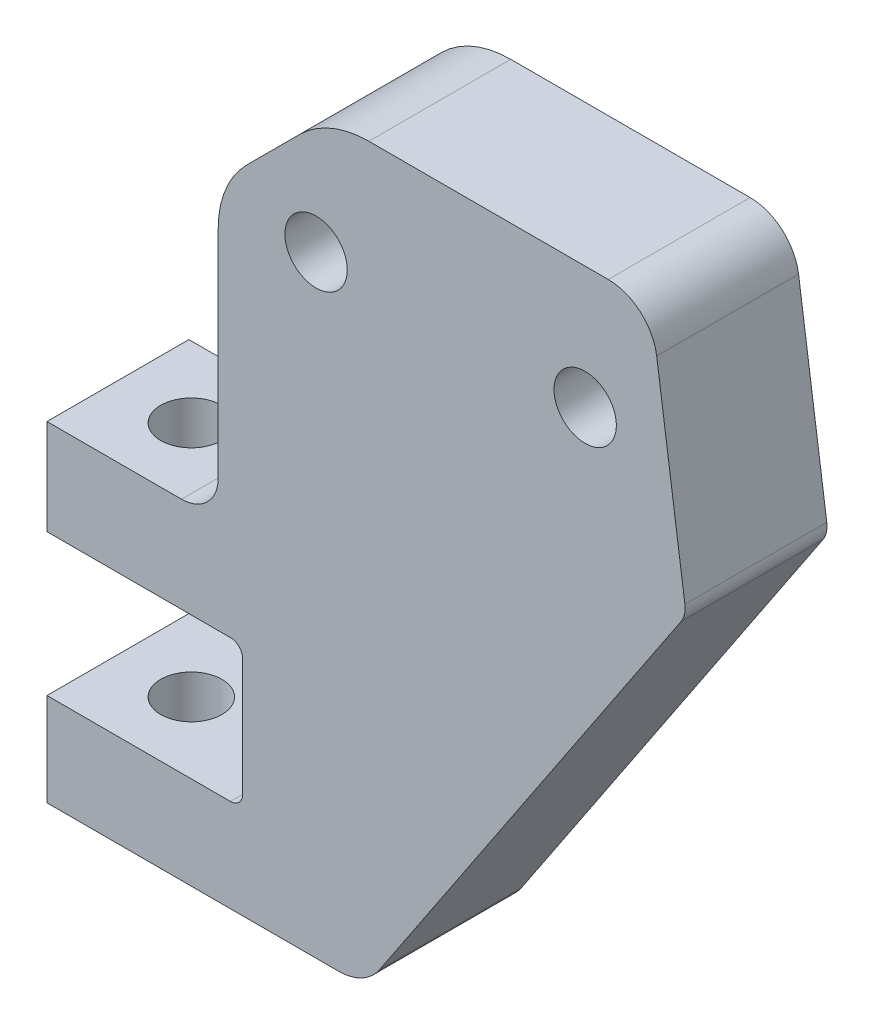
ISO-10303-21;
HEADER;
FILE_DESCRIPTION(('STEP AP214'),'2;1');
FILE_NAME('part.step','',(''),(''),'','','');
FILE_SCHEMA(('AUTOMOTIVE_DESIGN { 1 0 10303 214 1 1 1 1 }'));
ENDSEC;
DATA;
#1=APPLICATION_CONTEXT('core data for automotive mechanical design processes');
#2=APPLICATION_PROTOCOL_DEFINITION('international standard','automotive_design',2000,#1);
#3=PRODUCT_CONTEXT('',#1,'mechanical');
#4=PRODUCT('Part','Part','',(#3));
#5=PRODUCT_RELATED_PRODUCT_CATEGORY('part','',(#4));
#6=PRODUCT_DEFINITION_FORMATION('','',#4);
#7=PRODUCT_DEFINITION_CONTEXT('part definition',#1,'design');
#8=PRODUCT_DEFINITION('design','',#6,#7);
#9=PRODUCT_DEFINITION_SHAPE('','',#8);
#10=(LENGTH_UNIT() NAMED_UNIT(*) SI_UNIT(.MILLI.,.METRE.));
#11=(NAMED_UNIT(*) PLANE_ANGLE_UNIT() SI_UNIT($,.RADIAN.));
#12=(NAMED_UNIT(*) SI_UNIT($,.STERADIAN.) SOLID_ANGLE_UNIT());
#13=UNCERTAINTY_MEASURE_WITH_UNIT(LENGTH_MEASURE(1.E-05),#10,'distance_accuracy_value','');
#14=(GEOMETRIC_REPRESENTATION_CONTEXT(3) GLOBAL_UNCERTAINTY_ASSIGNED_CONTEXT((#13)) GLOBAL_UNIT_ASSIGNED_CONTEXT((#10,
#11,#12)) REPRESENTATION_CONTEXT('',''));
#15=CARTESIAN_POINT('',(0.,0.,0.));
#16=DIRECTION('',(0.,0.,1.));
#17=DIRECTION('',(1.,0.,0.));
#18=AXIS2_PLACEMENT_3D('',#15,#16,#17);
#19=CARTESIAN_POINT('',(14.0862026003108,-5.06792046180176,0.));
#20=DIRECTION('',(0.,0.,1.));
#21=DIRECTION('',(1.,0.,0.));
#22=AXIS2_PLACEMENT_3D('',#19,#20,#21);
#23=CYLINDRICAL_SURFACE('',#22,1.);
#24=CARTESIAN_POINT('',(14.0862026003108,-5.06792046180176,-2.9));
#25=DIRECTION('',(0.,0.,1.));
#26=DIRECTION('',(1.,0.,0.));
#27=AXIS2_PLACEMENT_3D('',#24,#25,#26);
#28=CIRCLE('',#27,1.);
#29=CARTESIAN_POINT('',(15.0764706690524,-4.92874736084169,-2.9));
#30=VERTEX_POINT('',#29);
#31=CARTESIAN_POINT('',(14.9182528946487,-5.62262065802699,-2.9));
#32=VERTEX_POINT('',#31);
#33=EDGE_CURVE('E331',#30,#32,#28,.F.);
#34=ORIENTED_EDGE('',*,*,#33,.F.);
#35=DIRECTION('',(0.,0.,1.));
#36=VECTOR('',#35,1.);
#37=CARTESIAN_POINT('',(15.0764706690524,-4.9287473608417,0.));
#38=LINE('',#37,#36);
#39=CARTESIAN_POINT('',(15.0764706690524,-4.92874736084169,2.9));
#40=VERTEX_POINT('',#39);
#41=EDGE_CURVE('E141',#40,#30,#38,.F.);
#42=ORIENTED_EDGE('',*,*,#41,.F.);
#43=CARTESIAN_POINT('',(14.0862026003108,-5.06792046180176,2.9));
#44=DIRECTION('',(0.,0.,1.));
#45=DIRECTION('',(1.,0.,0.));
#46=AXIS2_PLACEMENT_3D('',#43,#44,#45);
#47=CIRCLE('',#46,1.);
#48=CARTESIAN_POINT('',(14.9182528946487,-5.622620658027,2.9));
#49=VERTEX_POINT('',#48);
#50=EDGE_CURVE('E19',#40,#49,#47,.F.);
#51=ORIENTED_EDGE('',*,*,#50,.T.);
#52=DIRECTION('',(0.,0.,1.));
#53=VECTOR('',#52,1.);
#54=CARTESIAN_POINT('',(14.9182528946487,-5.62262065802698,17.7543488591558));
#55=LINE('',#54,#53);
#56=EDGE_CURVE('E139',#32,#49,#55,.T.);
#57=ORIENTED_EDGE('',*,*,#56,.F.);
#58=EDGE_LOOP('',(#34,#42,#51,#57));
#59=FACE_BOUND('',#58,.T.);
#60=ADVANCED_FACE('F16',(#59),#23,.T.);
#61=CARTESIAN_POINT('',(-8.,5.82338621596751,0.));
#62=DIRECTION('',(0.,1.,0.));
#63=DIRECTION('',(0.,0.,1.));
#64=AXIS2_PLACEMENT_3D('',#61,#62,#63);
#65=CYLINDRICAL_SURFACE('',#64,1.25);
#66=CARTESIAN_POINT('',(-8.,-21.2,0.));
#67=DIRECTION('',(0.,1.,0.));
#68=DIRECTION('',(0.,0.,1.));
#69=AXIS2_PLACEMENT_3D('',#66,#67,#68);
#70=CIRCLE('',#69,1.25);
#71=CARTESIAN_POINT('',(-8.,-21.2,1.25));
#72=VERTEX_POINT('',#71);
#73=EDGE_CURVE('E231',#72,#72,#70,.T.);
#74=ORIENTED_EDGE('',*,*,#73,.T.);
#75=EDGE_LOOP('',(#74));
#76=FACE_BOUND('',#75,.T.);
#77=CARTESIAN_POINT('',(-8.,-25.,0.));
#78=DIRECTION('',(0.,1.,0.));
#79=DIRECTION('',(0.,0.,1.));
#80=AXIS2_PLACEMENT_3D('',#77,#78,#79);
#81=CIRCLE('',#80,1.25);
#82=CARTESIAN_POINT('',(-8.,-25.,1.25));
#83=VERTEX_POINT('',#82);
#84=EDGE_CURVE('E250',#83,#83,#81,.T.);
#85=ORIENTED_EDGE('',*,*,#84,.F.);
#86=EDGE_LOOP('',(#85));
#87=FACE_BOUND('',#86,.T.);
#88=ADVANCED_FACE('F627',(#76,#87),#65,.F.);
#89=CARTESIAN_POINT('',(-3.5,-20.7,40.3972801826251));
#90=DIRECTION('',(0.,0.,-1.));
#91=DIRECTION('',(-1.,0.,0.));
#92=AXIS2_PLACEMENT_3D('',#89,#90,#91);
#93=CYLINDRICAL_SURFACE('',#92,0.5);
#94=DIRECTION('',(0.,0.,-1.));
#95=VECTOR('',#94,1.);
#96=CARTESIAN_POINT('',(-3.,-20.7,40.3972801826251));
#97=LINE('',#96,#95);
#98=CARTESIAN_POINT('',(-3.,-20.7,2.9));
#99=VERTEX_POINT('',#98);
#100=CARTESIAN_POINT('',(-3.,-20.7,-2.9));
#101=VERTEX_POINT('',#100);
#102=EDGE_CURVE('E217',#99,#101,#97,.T.);
#103=ORIENTED_EDGE('',*,*,#102,.T.);
#104=CARTESIAN_POINT('',(-3.5,-20.7,-2.9));
#105=DIRECTION('',(0.,0.,-1.));
#106=DIRECTION('',(-1.,0.,0.));
#107=AXIS2_PLACEMENT_3D('',#104,#105,#106);
#108=CIRCLE('',#107,0.5);
#109=CARTESIAN_POINT('',(-3.5,-21.2,-2.9));
#110=VERTEX_POINT('',#109);
#111=EDGE_CURVE('E329',#110,#101,#108,.F.);
#112=ORIENTED_EDGE('',*,*,#111,.F.);
#113=DIRECTION('',(0.,0.,1.));
#114=VECTOR('',#113,1.);
#115=CARTESIAN_POINT('',(-3.5,-21.2,40.3972801826251));
#116=LINE('',#115,#114);
#117=CARTESIAN_POINT('',(-3.5,-21.2,2.9));
#118=VERTEX_POINT('',#117);
#119=EDGE_CURVE('E224',#110,#118,#116,.T.);
#120=ORIENTED_EDGE('',*,*,#119,.T.);
#121=CARTESIAN_POINT('',(-3.5,-20.7,2.9));
#122=DIRECTION('',(0.,0.,-1.));
#123=DIRECTION('',(-1.,0.,0.));
#124=AXIS2_PLACEMENT_3D('',#121,#122,#123);
#125=CIRCLE('',#124,0.5);
#126=EDGE_CURVE('E143',#99,#118,#125,.T.);
#127=ORIENTED_EDGE('',*,*,#126,.F.);
#128=EDGE_LOOP('',(#103,#112,#120,#127));
#129=FACE_BOUND('',#128,.T.);
#130=ADVANCED_FACE('F343',(#129),#93,.F.);
#131=CARTESIAN_POINT('',(-3.5,-15.9,40.3972801826251));
#132=DIRECTION('',(0.,0.,-1.));
#133=DIRECTION('',(-1.,0.,0.));
#134=AXIS2_PLACEMENT_3D('',#131,#132,#133);
#135=CYLINDRICAL_SURFACE('',#134,0.5);
#136=DIRECTION('',(0.,0.,1.));
#137=VECTOR('',#136,1.);
#138=CARTESIAN_POINT('',(-3.5,-15.4,40.3972801826251));
#139=LINE('',#138,#137);
#140=CARTESIAN_POINT('',(-3.5,-15.4,2.9));
#141=VERTEX_POINT('',#140);
#142=CARTESIAN_POINT('',(-3.5,-15.4,-2.9));
#143=VERTEX_POINT('',#142);
#144=EDGE_CURVE('E213',#141,#143,#139,.F.);
#145=ORIENTED_EDGE('',*,*,#144,.T.);
#146=CARTESIAN_POINT('',(-3.5,-15.9,-2.9));
#147=DIRECTION('',(0.,0.,-1.));
#148=DIRECTION('',(-1.,0.,0.));
#149=AXIS2_PLACEMENT_3D('',#146,#147,#148);
#150=CIRCLE('',#149,0.5);
#151=CARTESIAN_POINT('',(-3.,-15.9,-2.9));
#152=VERTEX_POINT('',#151);
#153=EDGE_CURVE('E327',#152,#143,#150,.F.);
#154=ORIENTED_EDGE('',*,*,#153,.F.);
#155=DIRECTION('',(0.,0.,-1.));
#156=VECTOR('',#155,1.);
#157=CARTESIAN_POINT('',(-3.,-15.9,40.3972801826251));
#158=LINE('',#157,#156);
#159=CARTESIAN_POINT('',(-3.,-15.9,2.9));
#160=VERTEX_POINT('',#159);
#161=EDGE_CURVE('E221',#152,#160,#158,.F.);
#162=ORIENTED_EDGE('',*,*,#161,.T.);
#163=CARTESIAN_POINT('',(-3.5,-15.9,2.9));
#164=DIRECTION('',(0.,0.,-1.));
#165=DIRECTION('',(-1.,0.,0.));
#166=AXIS2_PLACEMENT_3D('',#163,#164,#165);
#167=CIRCLE('',#166,0.5);
#168=EDGE_CURVE('E333',#141,#160,#167,.T.);
#169=ORIENTED_EDGE('',*,*,#168,.F.);
#170=EDGE_LOOP('',(#145,#154,#162,#169));
#171=FACE_BOUND('',#170,.T.);
#172=ADVANCED_FACE('F435',(#171),#135,.F.);
#173=CARTESIAN_POINT('',(-8.,5.82338621596751,0.));
#174=DIRECTION('',(0.,1.,0.));
#175=DIRECTION('',(0.,0.,1.));
#176=AXIS2_PLACEMENT_3D('',#173,#174,#175);
#177=CYLINDRICAL_SURFACE('',#176,1.25);
#178=CARTESIAN_POINT('',(-8.,-11.5,0.));
#179=DIRECTION('',(0.,1.,0.));
#180=DIRECTION('',(0.,0.,1.));
#181=AXIS2_PLACEMENT_3D('',#178,#179,#180);
#182=CIRCLE('',#181,1.25);
#183=CARTESIAN_POINT('',(-8.,-11.5,1.25));
#184=VERTEX_POINT('',#183);
#185=EDGE_CURVE('E196',#184,#184,#182,.T.);
#186=ORIENTED_EDGE('',*,*,#185,.T.);
#187=EDGE_LOOP('',(#186));
#188=FACE_BOUND('',#187,.T.);
#189=CARTESIAN_POINT('',(-8.,-15.4,0.));
#190=DIRECTION('',(0.,1.,0.));
#191=DIRECTION('',(0.,0.,1.));
#192=AXIS2_PLACEMENT_3D('',#189,#190,#191);
#193=CIRCLE('',#192,1.25);
#194=CARTESIAN_POINT('',(-8.,-15.4,1.25));
#195=VERTEX_POINT('',#194);
#196=EDGE_CURVE('E216',#195,#195,#193,.F.);
#197=ORIENTED_EDGE('',*,*,#196,.T.);
#198=EDGE_LOOP('',(#197));
#199=FACE_BOUND('',#198,.T.);
#200=ADVANCED_FACE('F604',(#188,#199),#177,.F.);
#201=CARTESIAN_POINT('',(0.,0.,-2.9));
#202=DIRECTION('',(0.,0.,-1.));
#203=DIRECTION('',(-1.,0.,0.));
#204=AXIS2_PLACEMENT_3D('',#201,#202,#203);
#205=PLANE('',#204);
#206=DIRECTION('',(1.,0.,0.));
#207=VECTOR('',#206,1.);
#208=CARTESIAN_POINT('',(-4.,-11.5,-2.9));
#209=LINE('',#208,#207);
#210=CARTESIAN_POINT('',(-11.,-11.5,-2.9));
#211=VERTEX_POINT('',#210);
#212=CARTESIAN_POINT('',(-5.5,-11.5,-2.9));
#213=VERTEX_POINT('',#212);
#214=EDGE_CURVE('E192',#211,#213,#209,.T.);
#215=ORIENTED_EDGE('',*,*,#214,.T.);
#216=CARTESIAN_POINT('',(-5.5,-10.,-2.9));
#217=DIRECTION('',(0.,0.,-1.));
#218=DIRECTION('',(-1.,0.,0.));
#219=AXIS2_PLACEMENT_3D('',#216,#217,#218);
#220=CIRCLE('',#219,1.5);
#221=CARTESIAN_POINT('',(-4.,-10.,-2.9));
#222=VERTEX_POINT('',#221);
#223=EDGE_CURVE('E188',#213,#222,#220,.F.);
#224=ORIENTED_EDGE('',*,*,#223,.T.);
#225=DIRECTION('',(0.,1.,0.));
#226=VECTOR('',#225,1.);
#227=CARTESIAN_POINT('',(-4.,21.5,-2.9));
#228=LINE('',#227,#226);
#229=CARTESIAN_POINT('',(-4.,-1.15685424949238,-2.9));
#230=VERTEX_POINT('',#229);
#231=EDGE_CURVE('E187',#222,#230,#228,.T.);
#232=ORIENTED_EDGE('',*,*,#231,.T.);
#233=CARTESIAN_POINT('',(0.,-1.15685424949238,-2.9));
#234=DIRECTION('',(0.,0.,-1.));
#235=DIRECTION('',(-1.,0.,0.));
#236=AXIS2_PLACEMENT_3D('',#233,#234,#235);
#237=CIRCLE('',#236,4.);
#238=CARTESIAN_POINT('',(-2.82842712474619,1.67157287525381,-2.9));
#239=VERTEX_POINT('',#238);
#240=EDGE_CURVE('E183',#239,#230,#237,.F.);
#241=ORIENTED_EDGE('',*,*,#240,.F.);
#242=DIRECTION('',(-0.707106781186548,-0.707106781186548,0.));
#243=VECTOR('',#242,1.);
#244=CARTESIAN_POINT('',(-4.,0.5,-2.9));
#245=LINE('',#244,#243);
#246=CARTESIAN_POINT('',(-0.671572875253806,3.82842712474619,-2.9));
#247=VERTEX_POINT('',#246);
#248=EDGE_CURVE('E177',#247,#239,#245,.T.);
#249=ORIENTED_EDGE('',*,*,#248,.F.);
#250=CARTESIAN_POINT('',(2.15685424949239,1.,-2.9));
#251=DIRECTION('',(0.,0.,-1.));
#252=DIRECTION('',(-1.,0.,0.));
#253=AXIS2_PLACEMENT_3D('',#250,#251,#252);
#254=CIRCLE('',#253,4.);
#255=CARTESIAN_POINT('',(2.15685424949239,5.,-2.9));
#256=VERTEX_POINT('',#255);
#257=EDGE_CURVE('E292',#256,#247,#254,.F.);
#258=ORIENTED_EDGE('',*,*,#257,.F.);
#259=DIRECTION('',(1.,0.,0.));
#260=VECTOR('',#259,1.);
#261=CARTESIAN_POINT('',(-11.,5.,-2.9));
#262=LINE('',#261,#260);
#263=CARTESIAN_POINT('',(11.9425027517781,5.,-2.9));
#264=VERTEX_POINT('',#263);
#265=EDGE_CURVE('E261',#264,#256,#262,.F.);
#266=ORIENTED_EDGE('',*,*,#265,.F.);
#267=CARTESIAN_POINT('',(11.9425027517781,3.,-2.9));
#268=DIRECTION('',(0.,0.,1.));
#269=DIRECTION('',(1.,0.,0.));
#270=AXIS2_PLACEMENT_3D('',#267,#268,#269);
#271=CIRCLE('',#270,2.);
#272=CARTESIAN_POINT('',(13.9230388892612,3.27834620192013,-2.9));
#273=VERTEX_POINT('',#272);
#274=EDGE_CURVE('E258',#273,#264,#271,.T.);
#275=ORIENTED_EDGE('',*,*,#274,.F.);
#276=DIRECTION('',(-0.139173100960065,0.99026806874157,0.));
#277=VECTOR('',#276,1.);
#278=CARTESIAN_POINT('',(16.,-11.5,-2.9));
#279=LINE('',#278,#277);
#280=EDGE_CURVE('E254',#30,#273,#279,.T.);
#281=ORIENTED_EDGE('',*,*,#280,.F.);
#282=ORIENTED_EDGE('',*,*,#33,.T.);
#283=DIRECTION('',(0.554700196225229,0.832050294337844,0.));
#284=VECTOR('',#283,1.);
#285=CARTESIAN_POINT('',(16.,-4.,-2.9));
#286=LINE('',#285,#284);
#287=CARTESIAN_POINT('',(2.59373307169969,-24.1094003924505,-2.9));
#288=VERTEX_POINT('',#287);
#289=EDGE_CURVE('E151',#288,#32,#286,.T.);
#290=ORIENTED_EDGE('',*,*,#289,.F.);
#291=CARTESIAN_POINT('',(0.929632483024004,-23.,-2.9));
#292=DIRECTION('',(0.,0.,1.));
#293=DIRECTION('',(1.,0.,0.));
#294=AXIS2_PLACEMENT_3D('',#291,#292,#293);
#295=CIRCLE('',#294,2.);
#296=CARTESIAN_POINT('',(0.929632483024004,-25.,-2.9));
#297=VERTEX_POINT('',#296);
#298=EDGE_CURVE('E152',#297,#288,#295,.T.);
#299=ORIENTED_EDGE('',*,*,#298,.F.);
#300=DIRECTION('',(1.,0.,0.));
#301=VECTOR('',#300,1.);
#302=CARTESIAN_POINT('',(16.,-25.,-2.9));
#303=LINE('',#302,#301);
#304=CARTESIAN_POINT('',(-11.,-25.,-2.9));
#305=VERTEX_POINT('',#304);
#306=EDGE_CURVE('E248',#305,#297,#303,.T.);
#307=ORIENTED_EDGE('',*,*,#306,.F.);
#308=DIRECTION('',(0.,1.,0.));
#309=VECTOR('',#308,1.);
#310=CARTESIAN_POINT('',(-11.,-25.,-2.9));
#311=LINE('',#310,#309);
#312=CARTESIAN_POINT('',(-11.,-21.2,-2.9));
#313=VERTEX_POINT('',#312);
#314=EDGE_CURVE('E243',#313,#305,#311,.F.);
#315=ORIENTED_EDGE('',*,*,#314,.F.);
#316=DIRECTION('',(1.,0.,0.));
#317=VECTOR('',#316,1.);
#318=CARTESIAN_POINT('',(-3.,-21.2,-2.9));
#319=LINE('',#318,#317);
#320=EDGE_CURVE('E227',#313,#110,#319,.T.);
#321=ORIENTED_EDGE('',*,*,#320,.T.);
#322=ORIENTED_EDGE('',*,*,#111,.T.);
#323=DIRECTION('',(0.,1.,0.));
#324=VECTOR('',#323,1.);
#325=CARTESIAN_POINT('',(-3.,-15.4,-2.9));
#326=LINE('',#325,#324);
#327=EDGE_CURVE('E220',#101,#152,#326,.T.);
#328=ORIENTED_EDGE('',*,*,#327,.T.);
#329=ORIENTED_EDGE('',*,*,#153,.T.);
#330=DIRECTION('',(1.,0.,0.));
#331=VECTOR('',#330,1.);
#332=CARTESIAN_POINT('',(-18.,-15.4,-2.9));
#333=LINE('',#332,#331);
#334=CARTESIAN_POINT('',(-11.,-15.4,-2.9));
#335=VERTEX_POINT('',#334);
#336=EDGE_CURVE('E210',#143,#335,#333,.F.);
#337=ORIENTED_EDGE('',*,*,#336,.T.);
#338=DIRECTION('',(0.,1.,0.));
#339=VECTOR('',#338,1.);
#340=CARTESIAN_POINT('',(-11.,-25.,-2.9));
#341=LINE('',#340,#339);
#342=EDGE_CURVE('E209',#211,#335,#341,.F.);
#343=ORIENTED_EDGE('',*,*,#342,.F.);
#344=EDGE_LOOP('',(#215,#224,#232,#241,#249,#258,#266,#275,#281,#282,#290,#299,#307,#315,#321,
#322,#328,#329,#337,#343));
#345=FACE_BOUND('',#344,.T.);
#346=CARTESIAN_POINT('',(0.,0.,-2.9));
#347=DIRECTION('',(0.,0.,1.));
#348=DIRECTION('',(1.,0.,0.));
#349=AXIS2_PLACEMENT_3D('',#346,#347,#348);
#350=CIRCLE('',#349,1.275);
#351=CARTESIAN_POINT('',(1.275,0.,-2.9));
#352=VERTEX_POINT('',#351);
#353=EDGE_CURVE('E321',#352,#352,#350,.T.);
#354=ORIENTED_EDGE('',*,*,#353,.T.);
#355=EDGE_LOOP('',(#354));
#356=FACE_BOUND('',#355,.T.);
#357=CARTESIAN_POINT('',(11.,0.,-2.9));
#358=DIRECTION('',(0.,0.,1.));
#359=DIRECTION('',(1.,0.,0.));
#360=AXIS2_PLACEMENT_3D('',#357,#358,#359);
#361=CIRCLE('',#360,1.275);
#362=CARTESIAN_POINT('',(12.275,0.,-2.9));
#363=VERTEX_POINT('',#362);
#364=EDGE_CURVE('E324',#363,#363,#361,.T.);
#365=ORIENTED_EDGE('',*,*,#364,.T.);
#366=EDGE_LOOP('',(#365));
#367=FACE_BOUND('',#366,.T.);
#368=ADVANCED_FACE('F366',(#345,#356,#367),#205,.T.);
#369=CARTESIAN_POINT('',(11.,0.,2.9));
#370=DIRECTION('',(0.,0.,1.));
#371=DIRECTION('',(1.,0.,0.));
#372=AXIS2_PLACEMENT_3D('',#369,#370,#371);
#373=CYLINDRICAL_SURFACE('',#372,1.275);
#374=ORIENTED_EDGE('',*,*,#364,.F.);
#375=EDGE_LOOP('',(#374));
#376=FACE_BOUND('',#375,.T.);
#377=CARTESIAN_POINT('',(11.,0.,2.9));
#378=DIRECTION('',(0.,0.,1.));
#379=DIRECTION('',(1.,0.,0.));
#380=AXIS2_PLACEMENT_3D('',#377,#378,#379);
#381=CIRCLE('',#380,1.275);
#382=CARTESIAN_POINT('',(12.275,0.,2.9));
#383=VERTEX_POINT('',#382);
#384=EDGE_CURVE('E180',#383,#383,#381,.T.);
#385=ORIENTED_EDGE('',*,*,#384,.T.);
#386=EDGE_LOOP('',(#385));
#387=FACE_BOUND('',#386,.T.);
#388=ADVANCED_FACE('F587',(#376,#387),#373,.F.);
#389=CARTESIAN_POINT('',(0.,0.,2.9));
#390=DIRECTION('',(0.,0.,1.));
#391=DIRECTION('',(1.,0.,0.));
#392=AXIS2_PLACEMENT_3D('',#389,#390,#391);
#393=CYLINDRICAL_SURFACE('',#392,1.275);
#394=ORIENTED_EDGE('',*,*,#353,.F.);
#395=EDGE_LOOP('',(#394));
#396=FACE_BOUND('',#395,.T.);
#397=CARTESIAN_POINT('',(0.,0.,2.9));
#398=DIRECTION('',(0.,0.,1.));
#399=DIRECTION('',(1.,0.,0.));
#400=AXIS2_PLACEMENT_3D('',#397,#398,#399);
#401=CIRCLE('',#400,1.275);
#402=CARTESIAN_POINT('',(1.275,0.,2.9));
#403=VERTEX_POINT('',#402);
#404=EDGE_CURVE('E303',#403,#403,#401,.T.);
#405=ORIENTED_EDGE('',*,*,#404,.T.);
#406=EDGE_LOOP('',(#405));
#407=FACE_BOUND('',#406,.T.);
#408=ADVANCED_FACE('F579',(#396,#407),#393,.F.);
#409=CARTESIAN_POINT('',(2.15685424949239,1.,2.9));
#410=DIRECTION('',(0.,0.,-1.));
#411=DIRECTION('',(-1.,0.,0.));
#412=AXIS2_PLACEMENT_3D('',#409,#410,#411);
#413=CYLINDRICAL_SURFACE('',#412,4.);
#414=CARTESIAN_POINT('',(2.15685424949239,1.,2.9));
#415=DIRECTION('',(0.,0.,-1.));
#416=DIRECTION('',(-1.,0.,0.));
#417=AXIS2_PLACEMENT_3D('',#414,#415,#416);
#418=CIRCLE('',#417,4.);
#419=CARTESIAN_POINT('',(-0.671572875253802,3.82842712474619,2.9));
#420=VERTEX_POINT('',#419);
#421=CARTESIAN_POINT('',(2.15685424949239,5.,2.9));
#422=VERTEX_POINT('',#421);
#423=EDGE_CURVE('E174',#420,#422,#418,.T.);
#424=ORIENTED_EDGE('',*,*,#423,.T.);
#425=DIRECTION('',(0.,0.,1.));
#426=VECTOR('',#425,1.);
#427=CARTESIAN_POINT('',(2.15685424949239,5.,2.9));
#428=LINE('',#427,#426);
#429=EDGE_CURVE('E259',#256,#422,#428,.T.);
#430=ORIENTED_EDGE('',*,*,#429,.F.);
#431=ORIENTED_EDGE('',*,*,#257,.T.);
#432=DIRECTION('',(0.,0.,1.));
#433=VECTOR('',#432,1.);
#434=CARTESIAN_POINT('',(-0.671572875253807,3.82842712474619,15.3434969146578));
#435=LINE('',#434,#433);
#436=EDGE_CURVE('E176',#420,#247,#435,.F.);
#437=ORIENTED_EDGE('',*,*,#436,.F.);
#438=EDGE_LOOP('',(#424,#430,#431,#437));
#439=FACE_BOUND('',#438,.T.);
#440=ADVANCED_FACE('F385',(#439),#413,.T.);
#441=CARTESIAN_POINT('',(-11.,5.,2.9));
#442=DIRECTION('',(0.,1.,0.));
#443=DIRECTION('',(0.,0.,1.));
#444=AXIS2_PLACEMENT_3D('',#441,#442,#443);
#445=PLANE('',#444);
#446=DIRECTION('',(-1.,0.,0.));
#447=VECTOR('',#446,1.);
#448=CARTESIAN_POINT('',(0.,5.,2.9));
#449=LINE('',#448,#447);
#450=CARTESIAN_POINT('',(11.9425027517781,5.,2.9));
#451=VERTEX_POINT('',#450);
#452=EDGE_CURVE('E171',#422,#451,#449,.F.);
#453=ORIENTED_EDGE('',*,*,#452,.T.);
#454=DIRECTION('',(0.,0.,1.));
#455=VECTOR('',#454,1.);
#456=CARTESIAN_POINT('',(11.9425027517781,5.,2.9));
#457=LINE('',#456,#455);
#458=EDGE_CURVE('E256',#264,#451,#457,.T.);
#459=ORIENTED_EDGE('',*,*,#458,.F.);
#460=ORIENTED_EDGE('',*,*,#265,.T.);
#461=ORIENTED_EDGE('',*,*,#429,.T.);
#462=EDGE_LOOP('',(#453,#459,#460,#461));
#463=FACE_BOUND('',#462,.T.);
#464=ADVANCED_FACE('F380',(#463),#445,.T.);
#465=CARTESIAN_POINT('',(11.9425027517781,3.,2.9));
#466=DIRECTION('',(0.,0.,1.));
#467=DIRECTION('',(1.,0.,0.));
#468=AXIS2_PLACEMENT_3D('',#465,#466,#467);
#469=CYLINDRICAL_SURFACE('',#468,2.);
#470=ORIENTED_EDGE('',*,*,#274,.T.);
#471=ORIENTED_EDGE('',*,*,#458,.T.);
#472=CARTESIAN_POINT('',(11.9425027517781,3.,2.9));
#473=DIRECTION('',(0.,0.,1.));
#474=DIRECTION('',(1.,0.,0.));
#475=AXIS2_PLACEMENT_3D('',#472,#473,#474);
#476=CIRCLE('',#475,2.);
#477=CARTESIAN_POINT('',(13.9230388892612,3.27834620192014,2.9));
#478=VERTEX_POINT('',#477);
#479=EDGE_CURVE('E165',#451,#478,#476,.F.);
#480=ORIENTED_EDGE('',*,*,#479,.T.);
#481=DIRECTION('',(0.,0.,1.));
#482=VECTOR('',#481,1.);
#483=CARTESIAN_POINT('',(13.9230388892612,3.27834620192014,0.));
#484=LINE('',#483,#482);
#485=EDGE_CURVE('E252',#273,#478,#484,.T.);
#486=ORIENTED_EDGE('',*,*,#485,.F.);
#487=EDGE_LOOP('',(#470,#471,#480,#486));
#488=FACE_BOUND('',#487,.T.);
#489=ADVANCED_FACE('F376',(#488),#469,.T.);
#490=CARTESIAN_POINT('',(16.,-11.5,0.));
#491=DIRECTION('',(0.99026806874157,0.139173100960065,0.));
#492=DIRECTION('',(-0.139173100960065,0.99026806874157,0.));
#493=AXIS2_PLACEMENT_3D('',#490,#491,#492);
#494=PLANE('',#493);
#495=DIRECTION('',(0.139173100960069,-0.99026806874157,0.));
#496=VECTOR('',#495,1.);
#497=CARTESIAN_POINT('',(13.9230388892612,3.27834620192013,2.9));
#498=LINE('',#497,#496);
#499=EDGE_CURVE('E161',#478,#40,#498,.T.);
#500=ORIENTED_EDGE('',*,*,#499,.T.);
#501=ORIENTED_EDGE('',*,*,#41,.T.);
#502=ORIENTED_EDGE('',*,*,#280,.T.);
#503=ORIENTED_EDGE('',*,*,#485,.T.);
#504=EDGE_LOOP('',(#500,#501,#502,#503));
#505=FACE_BOUND('',#504,.T.);
#506=ADVANCED_FACE('F371',(#505),#494,.T.);
#507=CARTESIAN_POINT('',(16.,-4.,17.7543488591558));
#508=DIRECTION('',(0.832050294337844,-0.554700196225229,0.));
#509=DIRECTION('',(0.554700196225229,0.832050294337844,0.));
#510=AXIS2_PLACEMENT_3D('',#507,#508,#509);
#511=PLANE('',#510);
#512=DIRECTION('',(-0.554700196225229,-0.832050294337843,0.));
#513=VECTOR('',#512,1.);
#514=CARTESIAN_POINT('',(14.9182528946487,-5.62262065802699,2.9));
#515=LINE('',#514,#513);
#516=CARTESIAN_POINT('',(2.59373307169969,-24.1094003924505,2.9));
#517=VERTEX_POINT('',#516);
#518=EDGE_CURVE('E149',#49,#517,#515,.T.);
#519=ORIENTED_EDGE('',*,*,#518,.T.);
#520=DIRECTION('',(0.,0.,1.));
#521=VECTOR('',#520,1.);
#522=CARTESIAN_POINT('',(2.59373307169967,-24.1094003924505,17.7543488591558));
#523=LINE('',#522,#521);
#524=EDGE_CURVE('E249',#288,#517,#523,.T.);
#525=ORIENTED_EDGE('',*,*,#524,.F.);
#526=ORIENTED_EDGE('',*,*,#289,.T.);
#527=ORIENTED_EDGE('',*,*,#56,.T.);
#528=EDGE_LOOP('',(#519,#525,#526,#527));
#529=FACE_BOUND('',#528,.T.);
#530=ADVANCED_FACE('F147',(#529),#511,.T.);
#531=CARTESIAN_POINT('',(0.929632483024004,-23.,17.7543488591558));
#532=DIRECTION('',(0.,0.,1.));
#533=DIRECTION('',(1.,0.,0.));
#534=AXIS2_PLACEMENT_3D('',#531,#532,#533);
#535=CYLINDRICAL_SURFACE('',#534,2.);
#536=ORIENTED_EDGE('',*,*,#298,.T.);
#537=ORIENTED_EDGE('',*,*,#524,.T.);
#538=CARTESIAN_POINT('',(0.929632483024004,-23.,2.9));
#539=DIRECTION('',(0.,0.,1.));
#540=DIRECTION('',(1.,0.,0.));
#541=AXIS2_PLACEMENT_3D('',#538,#539,#540);
#542=CIRCLE('',#541,2.);
#543=CARTESIAN_POINT('',(0.929632483024004,-25.,2.9));
#544=VERTEX_POINT('',#543);
#545=EDGE_CURVE('E160',#517,#544,#542,.F.);
#546=ORIENTED_EDGE('',*,*,#545,.T.);
#547=DIRECTION('',(0.,0.,1.));
#548=VECTOR('',#547,1.);
#549=CARTESIAN_POINT('',(0.929632483024004,-25.,2.9));
#550=LINE('',#549,#548);
#551=EDGE_CURVE('E246',#297,#544,#550,.T.);
#552=ORIENTED_EDGE('',*,*,#551,.F.);
#553=EDGE_LOOP('',(#536,#537,#546,#552));
#554=FACE_BOUND('',#553,.T.);
#555=ADVANCED_FACE('F362',(#554),#535,.T.);
#556=CARTESIAN_POINT('',(16.,-25.,2.9));
#557=DIRECTION('',(0.,-1.,0.));
#558=DIRECTION('',(1.,0.,0.));
#559=AXIS2_PLACEMENT_3D('',#556,#557,#558);
#560=PLANE('',#559);
#561=DIRECTION('',(-1.,0.,0.));
#562=VECTOR('',#561,1.);
#563=CARTESIAN_POINT('',(0.,-25.,2.9));
#564=LINE('',#563,#562);
#565=CARTESIAN_POINT('',(-11.,-25.,2.9));
#566=VERTEX_POINT('',#565);
#567=EDGE_CURVE('E163',#544,#566,#564,.T.);
#568=ORIENTED_EDGE('',*,*,#567,.T.);
#569=DIRECTION('',(0.,0.,1.));
#570=VECTOR('',#569,1.);
#571=CARTESIAN_POINT('',(-11.,-25.,2.9));
#572=LINE('',#571,#570);
#573=EDGE_CURVE('E240',#305,#566,#572,.T.);
#574=ORIENTED_EDGE('',*,*,#573,.F.);
#575=ORIENTED_EDGE('',*,*,#306,.T.);
#576=ORIENTED_EDGE('',*,*,#551,.T.);
#577=EDGE_LOOP('',(#568,#574,#575,#576));
#578=FACE_BOUND('',#577,.T.);
#579=ORIENTED_EDGE('',*,*,#84,.T.);
#580=EDGE_LOOP('',(#579));
#581=FACE_BOUND('',#580,.T.);
#582=ADVANCED_FACE('F357',(#578,#581),#560,.T.);
#583=CARTESIAN_POINT('',(-11.,-25.,2.9));
#584=DIRECTION('',(-1.,0.,0.));
#585=DIRECTION('',(0.,0.,1.));
#586=AXIS2_PLACEMENT_3D('',#583,#584,#585);
#587=PLANE('',#586);
#588=ORIENTED_EDGE('',*,*,#573,.T.);
#589=DIRECTION('',(0.,1.,0.));
#590=VECTOR('',#589,1.);
#591=CARTESIAN_POINT('',(-11.,0.,2.9));
#592=LINE('',#591,#590);
#593=CARTESIAN_POINT('',(-11.,-21.2,2.9));
#594=VERTEX_POINT('',#593);
#595=EDGE_CURVE('E234',#566,#594,#592,.T.);
#596=ORIENTED_EDGE('',*,*,#595,.T.);
#597=DIRECTION('',(0.,0.,1.));
#598=VECTOR('',#597,1.);
#599=CARTESIAN_POINT('',(-11.,-21.2,40.3972801826251));
#600=LINE('',#599,#598);
#601=EDGE_CURVE('E228',#594,#313,#600,.F.);
#602=ORIENTED_EDGE('',*,*,#601,.T.);
#603=ORIENTED_EDGE('',*,*,#314,.T.);
#604=EDGE_LOOP('',(#588,#596,#602,#603));
#605=FACE_BOUND('',#604,.T.);
#606=ADVANCED_FACE('F429',(#605),#587,.T.);
#607=CARTESIAN_POINT('',(-3.,-21.2,40.3972801826251));
#608=DIRECTION('',(0.,-1.,0.));
#609=DIRECTION('',(1.,0.,0.));
#610=AXIS2_PLACEMENT_3D('',#607,#608,#609);
#611=PLANE('',#610);
#612=ORIENTED_EDGE('',*,*,#119,.F.);
#613=ORIENTED_EDGE('',*,*,#320,.F.);
#614=ORIENTED_EDGE('',*,*,#601,.F.);
#615=DIRECTION('',(-1.,0.,0.));
#616=VECTOR('',#615,1.);
#617=CARTESIAN_POINT('',(0.,-21.2,2.9));
#618=LINE('',#617,#616);
#619=EDGE_CURVE('E237',#594,#118,#618,.F.);
#620=ORIENTED_EDGE('',*,*,#619,.T.);
#621=EDGE_LOOP('',(#612,#613,#614,#620));
#622=FACE_BOUND('',#621,.T.);
#623=ORIENTED_EDGE('',*,*,#73,.F.);
#624=EDGE_LOOP('',(#623));
#625=FACE_BOUND('',#624,.T.);
#626=ADVANCED_FACE('F347',(#622,#625),#611,.F.);
#627=CARTESIAN_POINT('',(-3.,-15.4,40.3972801826251));
#628=DIRECTION('',(1.,0.,0.));
#629=DIRECTION('',(0.,0.,-1.));
#630=AXIS2_PLACEMENT_3D('',#627,#628,#629);
#631=PLANE('',#630);
#632=ORIENTED_EDGE('',*,*,#102,.F.);
#633=DIRECTION('',(0.,1.,0.));
#634=VECTOR('',#633,1.);
#635=CARTESIAN_POINT('',(-3.,0.,2.9));
#636=LINE('',#635,#634);
#637=EDGE_CURVE('E339',#99,#160,#636,.T.);
#638=ORIENTED_EDGE('',*,*,#637,.T.);
#639=ORIENTED_EDGE('',*,*,#161,.F.);
#640=ORIENTED_EDGE('',*,*,#327,.F.);
#641=EDGE_LOOP('',(#632,#638,#639,#640));
#642=FACE_BOUND('',#641,.T.);
#643=ADVANCED_FACE('F432',(#642),#631,.F.);
#644=CARTESIAN_POINT('',(-18.,-15.4,40.3972801826251));
#645=DIRECTION('',(0.,1.,0.));
#646=DIRECTION('',(0.,0.,1.));
#647=AXIS2_PLACEMENT_3D('',#644,#645,#646);
#648=PLANE('',#647);
#649=ORIENTED_EDGE('',*,*,#144,.F.);
#650=DIRECTION('',(-1.,0.,0.));
#651=VECTOR('',#650,1.);
#652=CARTESIAN_POINT('',(0.,-15.4,2.9));
#653=LINE('',#652,#651);
#654=CARTESIAN_POINT('',(-11.,-15.4,2.9));
#655=VERTEX_POINT('',#654);
#656=EDGE_CURVE('E203',#141,#655,#653,.T.);
#657=ORIENTED_EDGE('',*,*,#656,.T.);
#658=DIRECTION('',(0.,0.,1.));
#659=VECTOR('',#658,1.);
#660=CARTESIAN_POINT('',(-11.,-15.4,2.9));
#661=LINE('',#660,#659);
#662=EDGE_CURVE('E206',#335,#655,#661,.T.);
#663=ORIENTED_EDGE('',*,*,#662,.F.);
#664=ORIENTED_EDGE('',*,*,#336,.F.);
#665=EDGE_LOOP('',(#649,#657,#663,#664));
#666=FACE_BOUND('',#665,.T.);
#667=ORIENTED_EDGE('',*,*,#196,.F.);
#668=EDGE_LOOP('',(#667));
#669=FACE_BOUND('',#668,.T.);
#670=ADVANCED_FACE('F410',(#666,#669),#648,.F.);
#671=CARTESIAN_POINT('',(-11.,-25.,2.9));
#672=DIRECTION('',(-1.,0.,0.));
#673=DIRECTION('',(0.,0.,1.));
#674=AXIS2_PLACEMENT_3D('',#671,#672,#673);
#675=PLANE('',#674);
#676=DIRECTION('',(0.,0.,-1.));
#677=VECTOR('',#676,1.);
#678=CARTESIAN_POINT('',(-11.,-11.5,15.3434969146578));
#679=LINE('',#678,#677);
#680=CARTESIAN_POINT('',(-11.,-11.5,2.9));
#681=VERTEX_POINT('',#680);
#682=EDGE_CURVE('E193',#681,#211,#679,.T.);
#683=ORIENTED_EDGE('',*,*,#682,.T.);
#684=ORIENTED_EDGE('',*,*,#342,.T.);
#685=ORIENTED_EDGE('',*,*,#662,.T.);
#686=DIRECTION('',(0.,1.,0.));
#687=VECTOR('',#686,1.);
#688=CARTESIAN_POINT('',(-11.,0.,2.9));
#689=LINE('',#688,#687);
#690=EDGE_CURVE('E199',#655,#681,#689,.T.);
#691=ORIENTED_EDGE('',*,*,#690,.T.);
#692=EDGE_LOOP('',(#683,#684,#685,#691));
#693=FACE_BOUND('',#692,.T.);
#694=ADVANCED_FACE('F417',(#693),#675,.T.);
#695=CARTESIAN_POINT('',(-4.,-11.5,15.3434969146578));
#696=DIRECTION('',(0.,-1.,0.));
#697=DIRECTION('',(0.,0.,-1.));
#698=AXIS2_PLACEMENT_3D('',#695,#696,#697);
#699=PLANE('',#698);
#700=DIRECTION('',(0.,0.,-1.));
#701=VECTOR('',#700,1.);
#702=CARTESIAN_POINT('',(-5.5,-11.5,15.3434969146578));
#703=LINE('',#702,#701);
#704=CARTESIAN_POINT('',(-5.5,-11.5,2.9));
#705=VERTEX_POINT('',#704);
#706=EDGE_CURVE('E189',#705,#213,#703,.T.);
#707=ORIENTED_EDGE('',*,*,#706,.T.);
#708=ORIENTED_EDGE('',*,*,#214,.F.);
#709=ORIENTED_EDGE('',*,*,#682,.F.);
#710=DIRECTION('',(-1.,0.,0.));
#711=VECTOR('',#710,1.);
#712=CARTESIAN_POINT('',(0.,-11.5,2.9));
#713=LINE('',#712,#711);
#714=EDGE_CURVE('E202',#681,#705,#713,.F.);
#715=ORIENTED_EDGE('',*,*,#714,.T.);
#716=EDGE_LOOP('',(#707,#708,#709,#715));
#717=FACE_BOUND('',#716,.T.);
#718=ORIENTED_EDGE('',*,*,#185,.F.);
#719=EDGE_LOOP('',(#718));
#720=FACE_BOUND('',#719,.T.);
#721=ADVANCED_FACE('F437',(#717,#720),#699,.F.);
#722=CARTESIAN_POINT('',(-5.5,-10.,15.3434969146578));
#723=DIRECTION('',(0.,0.,-1.));
#724=DIRECTION('',(-1.,0.,0.));
#725=AXIS2_PLACEMENT_3D('',#722,#723,#724);
#726=CYLINDRICAL_SURFACE('',#725,1.5);
#727=DIRECTION('',(0.,0.,-1.));
#728=VECTOR('',#727,1.);
#729=CARTESIAN_POINT('',(-4.,-10.,15.3434969146578));
#730=LINE('',#729,#728);
#731=CARTESIAN_POINT('',(-4.,-10.,2.9));
#732=VERTEX_POINT('',#731);
#733=EDGE_CURVE('E184',#732,#222,#730,.T.);
#734=ORIENTED_EDGE('',*,*,#733,.T.);
#735=ORIENTED_EDGE('',*,*,#223,.F.);
#736=ORIENTED_EDGE('',*,*,#706,.F.);
#737=CARTESIAN_POINT('',(-5.5,-10.,2.9));
#738=DIRECTION('',(0.,0.,-1.));
#739=DIRECTION('',(-1.,0.,0.));
#740=AXIS2_PLACEMENT_3D('',#737,#738,#739);
#741=CIRCLE('',#740,1.5);
#742=EDGE_CURVE('E296',#705,#732,#741,.F.);
#743=ORIENTED_EDGE('',*,*,#742,.T.);
#744=EDGE_LOOP('',(#734,#735,#736,#743));
#745=FACE_BOUND('',#744,.T.);
#746=ADVANCED_FACE('F440',(#745),#726,.F.);
#747=CARTESIAN_POINT('',(-4.,21.5,15.3434969146578));
#748=DIRECTION('',(1.,0.,0.));
#749=DIRECTION('',(0.,0.,-1.));
#750=AXIS2_PLACEMENT_3D('',#747,#748,#749);
#751=PLANE('',#750);
#752=ORIENTED_EDGE('',*,*,#733,.F.);
#753=DIRECTION('',(0.,1.,0.));
#754=VECTOR('',#753,1.);
#755=CARTESIAN_POINT('',(-4.,0.,2.9));
#756=LINE('',#755,#754);
#757=CARTESIAN_POINT('',(-4.,-1.15685424949238,2.9));
#758=VERTEX_POINT('',#757);
#759=EDGE_CURVE('E295',#732,#758,#756,.T.);
#760=ORIENTED_EDGE('',*,*,#759,.T.);
#761=DIRECTION('',(0.,0.,-1.));
#762=VECTOR('',#761,1.);
#763=CARTESIAN_POINT('',(-4.,-1.15685424949238,15.3434969146578));
#764=LINE('',#763,#762);
#765=EDGE_CURVE('E181',#230,#758,#764,.F.);
#766=ORIENTED_EDGE('',*,*,#765,.F.);
#767=ORIENTED_EDGE('',*,*,#231,.F.);
#768=EDGE_LOOP('',(#752,#760,#766,#767));
#769=FACE_BOUND('',#768,.T.);
#770=ADVANCED_FACE('F396',(#769),#751,.F.);
#771=CARTESIAN_POINT('',(0.,-1.15685424949238,15.3434969146578));
#772=DIRECTION('',(0.,0.,-1.));
#773=DIRECTION('',(-1.,0.,0.));
#774=AXIS2_PLACEMENT_3D('',#771,#772,#773);
#775=CYLINDRICAL_SURFACE('',#774,4.);
#776=ORIENTED_EDGE('',*,*,#240,.T.);
#777=ORIENTED_EDGE('',*,*,#765,.T.);
#778=CARTESIAN_POINT('',(0.,-1.15685424949238,2.9));
#779=DIRECTION('',(0.,0.,-1.));
#780=DIRECTION('',(-1.,0.,0.));
#781=AXIS2_PLACEMENT_3D('',#778,#779,#780);
#782=CIRCLE('',#781,4.);
#783=CARTESIAN_POINT('',(-2.82842712474619,1.67157287525381,2.9));
#784=VERTEX_POINT('',#783);
#785=EDGE_CURVE('E25',#758,#784,#782,.T.);
#786=ORIENTED_EDGE('',*,*,#785,.T.);
#787=DIRECTION('',(0.,0.,1.));
#788=VECTOR('',#787,1.);
#789=CARTESIAN_POINT('',(-2.82842712474619,1.67157287525381,15.3434969146578));
#790=LINE('',#789,#788);
#791=EDGE_CURVE('E33',#239,#784,#790,.T.);
#792=ORIENTED_EDGE('',*,*,#791,.F.);
#793=EDGE_LOOP('',(#776,#777,#786,#792));
#794=FACE_BOUND('',#793,.T.);
#795=ADVANCED_FACE('F391',(#794),#775,.T.);
#796=CARTESIAN_POINT('',(-4.,0.5,15.3434969146578));
#797=DIRECTION('',(-0.707106781186548,0.707106781186548,0.));
#798=DIRECTION('',(-0.707106781186548,-0.707106781186548,0.));
#799=AXIS2_PLACEMENT_3D('',#796,#797,#798);
#800=PLANE('',#799);
#801=DIRECTION('',(0.707106781186548,0.707106781186546,0.));
#802=VECTOR('',#801,1.);
#803=CARTESIAN_POINT('',(-2.82842712474619,1.67157287525381,2.9));
#804=LINE('',#803,#802);
#805=EDGE_CURVE('E11',#784,#420,#804,.T.);
#806=ORIENTED_EDGE('',*,*,#805,.T.);
#807=ORIENTED_EDGE('',*,*,#436,.T.);
#808=ORIENTED_EDGE('',*,*,#248,.T.);
#809=ORIENTED_EDGE('',*,*,#791,.T.);
#810=EDGE_LOOP('',(#806,#807,#808,#809));
#811=FACE_BOUND('',#810,.T.);
#812=ADVANCED_FACE('F387',(#811),#800,.T.);
#813=CARTESIAN_POINT('',(0.,0.,2.9));
#814=DIRECTION('',(0.,0.,-1.));
#815=DIRECTION('',(-1.,0.,0.));
#816=AXIS2_PLACEMENT_3D('',#813,#814,#815);
#817=PLANE('',#816);
#818=ORIENTED_EDGE('',*,*,#785,.F.);
#819=ORIENTED_EDGE('',*,*,#759,.F.);
#820=ORIENTED_EDGE('',*,*,#742,.F.);
#821=ORIENTED_EDGE('',*,*,#714,.F.);
#822=ORIENTED_EDGE('',*,*,#690,.F.);
#823=ORIENTED_EDGE('',*,*,#656,.F.);
#824=ORIENTED_EDGE('',*,*,#168,.T.);
#825=ORIENTED_EDGE('',*,*,#637,.F.);
#826=ORIENTED_EDGE('',*,*,#126,.T.);
#827=ORIENTED_EDGE('',*,*,#619,.F.);
#828=ORIENTED_EDGE('',*,*,#595,.F.);
#829=ORIENTED_EDGE('',*,*,#567,.F.);
#830=ORIENTED_EDGE('',*,*,#545,.F.);
#831=ORIENTED_EDGE('',*,*,#518,.F.);
#832=ORIENTED_EDGE('',*,*,#50,.F.);
#833=ORIENTED_EDGE('',*,*,#499,.F.);
#834=ORIENTED_EDGE('',*,*,#479,.F.);
#835=ORIENTED_EDGE('',*,*,#452,.F.);
#836=ORIENTED_EDGE('',*,*,#423,.F.);
#837=ORIENTED_EDGE('',*,*,#805,.F.);
#838=EDGE_LOOP('',(#818,#819,#820,#821,#822,#823,#824,#825,#826,#827,#828,#829,#830,#831,#832,
#833,#834,#835,#836,#837));
#839=FACE_BOUND('',#838,.T.);
#840=ORIENTED_EDGE('',*,*,#404,.F.);
#841=EDGE_LOOP('',(#840));
#842=FACE_BOUND('',#841,.T.);
#843=ORIENTED_EDGE('',*,*,#384,.F.);
#844=EDGE_LOOP('',(#843));
#845=FACE_BOUND('',#844,.T.);
#846=ADVANCED_FACE('F156',(#839,#842,#845),#817,.F.);
#847=CLOSED_SHELL('',(#60,#88,#130,#172,#200,#368,#388,#408,#440,#464,#489,#506,#530,#555,#582,
#606,#626,#643,#670,#694,#721,#746,#770,#795,#812,#846));
#848=MANIFOLD_SOLID_BREP('B1',#847);
#849=ADVANCED_BREP_SHAPE_REPRESENTATION('',(#18,#848),#14);
#850=SHAPE_DEFINITION_REPRESENTATION(#9,#849);
ENDSEC;
END-ISO-10303-21;
